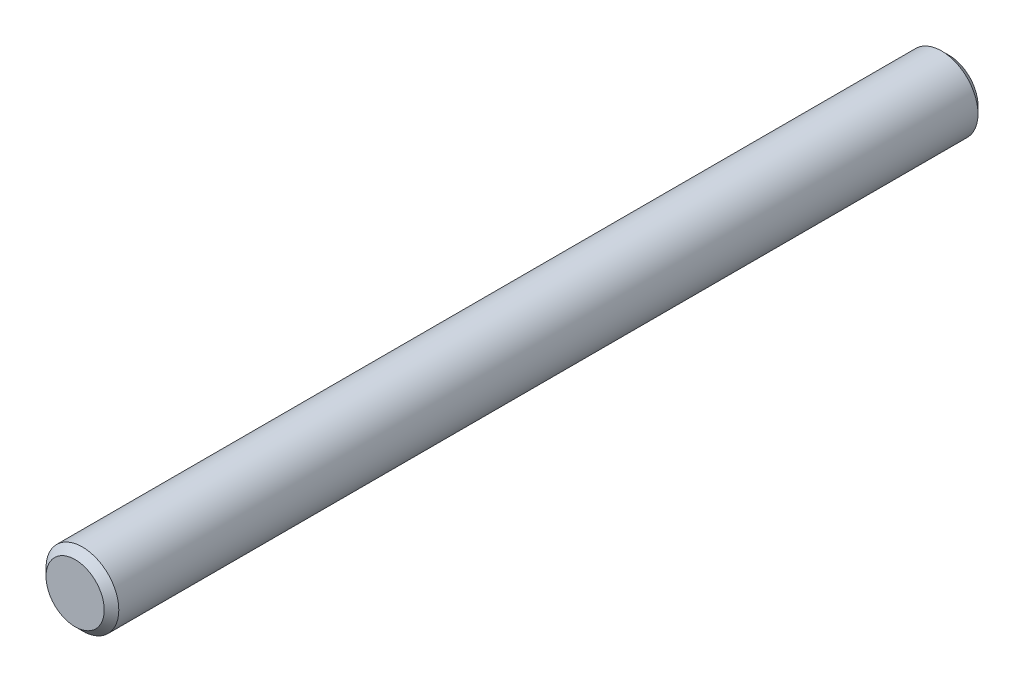
ISO-10303-21;
HEADER;
FILE_DESCRIPTION(('STEP AP214'),'2;1');
FILE_NAME('part.step','',(''),(''),'','','');
FILE_SCHEMA(('AUTOMOTIVE_DESIGN { 1 0 10303 214 1 1 1 1 }'));
ENDSEC;
DATA;
#1=APPLICATION_CONTEXT('core data for automotive mechanical design processes');
#2=APPLICATION_PROTOCOL_DEFINITION('international standard','automotive_design',2000,#1);
#3=PRODUCT_CONTEXT('',#1,'mechanical');
#4=PRODUCT('Part','Part','',(#3));
#5=PRODUCT_RELATED_PRODUCT_CATEGORY('part','',(#4));
#6=PRODUCT_DEFINITION_FORMATION('','',#4);
#7=PRODUCT_DEFINITION_CONTEXT('part definition',#1,'design');
#8=PRODUCT_DEFINITION('design','',#6,#7);
#9=PRODUCT_DEFINITION_SHAPE('','',#8);
#10=(LENGTH_UNIT() NAMED_UNIT(*) SI_UNIT(.MILLI.,.METRE.));
#11=(NAMED_UNIT(*) PLANE_ANGLE_UNIT() SI_UNIT($,.RADIAN.));
#12=(NAMED_UNIT(*) SI_UNIT($,.STERADIAN.) SOLID_ANGLE_UNIT());
#13=UNCERTAINTY_MEASURE_WITH_UNIT(LENGTH_MEASURE(1.E-05),#10,'distance_accuracy_value','');
#14=(GEOMETRIC_REPRESENTATION_CONTEXT(3) GLOBAL_UNCERTAINTY_ASSIGNED_CONTEXT((#13)) GLOBAL_UNIT_ASSIGNED_CONTEXT((#10,
#11,#12)) REPRESENTATION_CONTEXT('',''));
#15=CARTESIAN_POINT('',(0.,0.,0.));
#16=DIRECTION('',(0.,0.,1.));
#17=DIRECTION('',(1.,0.,0.));
#18=AXIS2_PLACEMENT_3D('',#15,#16,#17);
#19=CARTESIAN_POINT('',(0.,0.,60.));
#20=DIRECTION('',(0.,0.,-1.));
#21=DIRECTION('',(-1.,0.,0.));
#22=AXIS2_PLACEMENT_3D('',#19,#20,#21);
#23=CYLINDRICAL_SURFACE('',#22,2.5);
#24=CARTESIAN_POINT('',(0.,0.,0.5));
#25=DIRECTION('',(0.,0.,1.));
#26=DIRECTION('',(1.,0.,0.));
#27=AXIS2_PLACEMENT_3D('',#24,#25,#26);
#28=CIRCLE('',#27,2.5);
#29=CARTESIAN_POINT('',(2.5,0.,0.5));
#30=VERTEX_POINT('',#29);
#31=EDGE_CURVE('E57',#30,#30,#28,.T.);
#32=ORIENTED_EDGE('',*,*,#31,.T.);
#33=EDGE_LOOP('',(#32));
#34=FACE_BOUND('',#33,.T.);
#35=CARTESIAN_POINT('',(0.,0.,59.5));
#36=DIRECTION('',(0.,0.,1.));
#37=DIRECTION('',(1.,0.,0.));
#38=AXIS2_PLACEMENT_3D('',#35,#36,#37);
#39=CIRCLE('',#38,2.5);
#40=CARTESIAN_POINT('',(2.5,0.,59.5));
#41=VERTEX_POINT('',#40);
#42=EDGE_CURVE('E63',#41,#41,#39,.F.);
#43=ORIENTED_EDGE('',*,*,#42,.T.);
#44=EDGE_LOOP('',(#43));
#45=FACE_BOUND('',#44,.T.);
#46=ADVANCED_FACE('F40',(#34,#45),#23,.T.);
#47=CARTESIAN_POINT('',(0.,0.,60.));
#48=DIRECTION('',(0.,0.,1.));
#49=DIRECTION('',(1.,0.,0.));
#50=AXIS2_PLACEMENT_3D('',#47,#48,#49);
#51=PLANE('',#50);
#52=CARTESIAN_POINT('',(0.,0.,60.));
#53=DIRECTION('',(0.,0.,1.));
#54=DIRECTION('',(1.,0.,0.));
#55=AXIS2_PLACEMENT_3D('',#52,#53,#54);
#56=CIRCLE('',#55,2.);
#57=CARTESIAN_POINT('',(2.,0.,60.));
#58=VERTEX_POINT('',#57);
#59=EDGE_CURVE('E10',#58,#58,#56,.T.);
#60=ORIENTED_EDGE('',*,*,#59,.T.);
#61=EDGE_LOOP('',(#60));
#62=FACE_BOUND('',#61,.T.);
#63=ADVANCED_FACE('F79',(#62),#51,.T.);
#64=CARTESIAN_POINT('',(0.,0.,0.));
#65=DIRECTION('',(0.,0.,1.));
#66=DIRECTION('',(1.,0.,0.));
#67=AXIS2_PLACEMENT_3D('',#64,#65,#66);
#68=PLANE('',#67);
#69=CARTESIAN_POINT('',(0.,0.,0.));
#70=DIRECTION('',(0.,0.,1.));
#71=DIRECTION('',(1.,0.,0.));
#72=AXIS2_PLACEMENT_3D('',#69,#70,#71);
#73=CIRCLE('',#72,1.99999999999999);
#74=CARTESIAN_POINT('',(1.99999999999999,0.,0.));
#75=VERTEX_POINT('',#74);
#76=EDGE_CURVE('E49',#75,#75,#73,.F.);
#77=ORIENTED_EDGE('',*,*,#76,.T.);
#78=EDGE_LOOP('',(#77));
#79=FACE_BOUND('',#78,.T.);
#80=ADVANCED_FACE('F76',(#79),#68,.F.);
#81=CARTESIAN_POINT('',(0.,0.,0.5));
#82=DIRECTION('',(0.,0.,1.));
#83=DIRECTION('',(1.,0.,0.));
#84=AXIS2_PLACEMENT_3D('',#81,#82,#83);
#85=CONICAL_SURFACE('',#84,2.5,0.785398163397453);
#86=ORIENTED_EDGE('',*,*,#76,.F.);
#87=EDGE_LOOP('',(#86));
#88=FACE_BOUND('',#87,.T.);
#89=ORIENTED_EDGE('',*,*,#31,.F.);
#90=EDGE_LOOP('',(#89));
#91=FACE_BOUND('',#90,.T.);
#92=ADVANCED_FACE('F73',(#88,#91),#85,.T.);
#93=CARTESIAN_POINT('',(0.,0.,60.));
#94=DIRECTION('',(0.,0.,-1.));
#95=DIRECTION('',(-1.,0.,0.));
#96=AXIS2_PLACEMENT_3D('',#93,#94,#95);
#97=CONICAL_SURFACE('',#96,2.,0.785398163397439);
#98=ORIENTED_EDGE('',*,*,#42,.F.);
#99=EDGE_LOOP('',(#98));
#100=FACE_BOUND('',#99,.T.);
#101=ORIENTED_EDGE('',*,*,#59,.F.);
#102=EDGE_LOOP('',(#101));
#103=FACE_BOUND('',#102,.T.);
#104=ADVANCED_FACE('F43',(#100,#103),#97,.T.);
#105=CLOSED_SHELL('',(#46,#63,#80,#92,#104));
#106=MANIFOLD_SOLID_BREP('B2',#105);
#107=ADVANCED_BREP_SHAPE_REPRESENTATION('',(#18,#106),#14);
#108=SHAPE_DEFINITION_REPRESENTATION(#9,#107);
ENDSEC;
END-ISO-10303-21;
